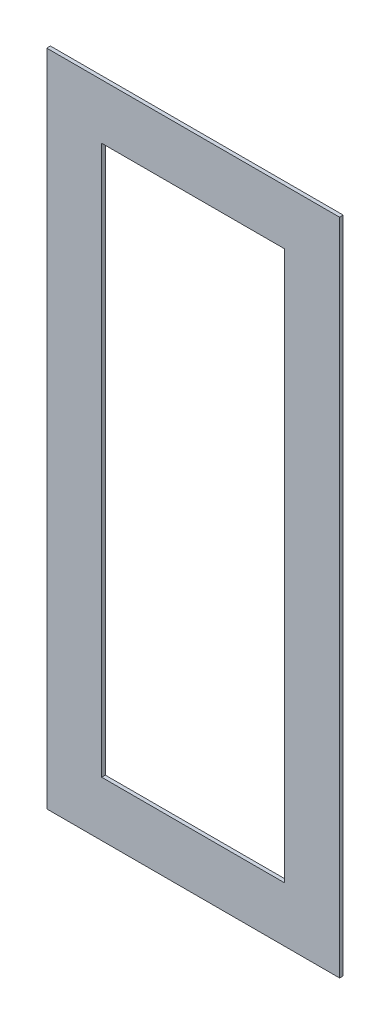
ISO-10303-21;
HEADER;
FILE_DESCRIPTION(('STEP AP214'),'2;1');
FILE_NAME('part.step','',(''),(''),'','','');
FILE_SCHEMA(('AUTOMOTIVE_DESIGN { 1 0 10303 214 1 1 1 1 }'));
ENDSEC;
DATA;
#1=APPLICATION_CONTEXT('core data for automotive mechanical design processes');
#2=APPLICATION_PROTOCOL_DEFINITION('international standard','automotive_design',2000,#1);
#3=PRODUCT_CONTEXT('',#1,'mechanical');
#4=PRODUCT('Part','Part','',(#3));
#5=PRODUCT_RELATED_PRODUCT_CATEGORY('part','',(#4));
#6=PRODUCT_DEFINITION_FORMATION('','',#4);
#7=PRODUCT_DEFINITION_CONTEXT('part definition',#1,'design');
#8=PRODUCT_DEFINITION('design','',#6,#7);
#9=PRODUCT_DEFINITION_SHAPE('','',#8);
#10=(LENGTH_UNIT() NAMED_UNIT(*) SI_UNIT(.MILLI.,.METRE.));
#11=(NAMED_UNIT(*) PLANE_ANGLE_UNIT() SI_UNIT($,.RADIAN.));
#12=(NAMED_UNIT(*) SI_UNIT($,.STERADIAN.) SOLID_ANGLE_UNIT());
#13=UNCERTAINTY_MEASURE_WITH_UNIT(LENGTH_MEASURE(1.E-05),#10,'distance_accuracy_value','');
#14=(GEOMETRIC_REPRESENTATION_CONTEXT(3) GLOBAL_UNCERTAINTY_ASSIGNED_CONTEXT((#13)) GLOBAL_UNIT_ASSIGNED_CONTEXT((#10,
#11,#12)) REPRESENTATION_CONTEXT('',''));
#15=CARTESIAN_POINT('',(0.,0.,0.));
#16=DIRECTION('',(0.,0.,1.));
#17=DIRECTION('',(1.,0.,0.));
#18=AXIS2_PLACEMENT_3D('',#15,#16,#17);
#19=CARTESIAN_POINT('',(0.,0.,0.2));
#20=DIRECTION('',(0.,0.,-1.));
#21=DIRECTION('',(-1.,0.,0.));
#22=AXIS2_PLACEMENT_3D('',#19,#20,#21);
#23=PLANE('',#22);
#24=DIRECTION('',(0.,1.,0.));
#25=VECTOR('',#24,1.);
#26=CARTESIAN_POINT('',(8.,18.,0.2));
#27=LINE('',#26,#25);
#28=CARTESIAN_POINT('',(8.,-18.,0.2));
#29=VERTEX_POINT('',#28);
#30=CARTESIAN_POINT('',(8.,18.,0.2));
#31=VERTEX_POINT('',#30);
#32=EDGE_CURVE('E134',#29,#31,#27,.T.);
#33=ORIENTED_EDGE('',*,*,#32,.T.);
#34=DIRECTION('',(-1.,0.,0.));
#35=VECTOR('',#34,1.);
#36=CARTESIAN_POINT('',(8.,18.,0.2));
#37=LINE('',#36,#35);
#38=CARTESIAN_POINT('',(-8.,18.,0.2));
#39=VERTEX_POINT('',#38);
#40=EDGE_CURVE('E137',#31,#39,#37,.T.);
#41=ORIENTED_EDGE('',*,*,#40,.T.);
#42=DIRECTION('',(0.,-1.,0.));
#43=VECTOR('',#42,1.);
#44=CARTESIAN_POINT('',(-8.,18.,0.2));
#45=LINE('',#44,#43);
#46=CARTESIAN_POINT('',(-8.,-18.,0.2));
#47=VERTEX_POINT('',#46);
#48=EDGE_CURVE('E140',#39,#47,#45,.T.);
#49=ORIENTED_EDGE('',*,*,#48,.T.);
#50=DIRECTION('',(1.,0.,0.));
#51=VECTOR('',#50,1.);
#52=CARTESIAN_POINT('',(8.,-18.,0.2));
#53=LINE('',#52,#51);
#54=EDGE_CURVE('E142',#47,#29,#53,.T.);
#55=ORIENTED_EDGE('',*,*,#54,.T.);
#56=EDGE_LOOP('',(#33,#41,#49,#55));
#57=FACE_BOUND('',#56,.T.);
#58=DIRECTION('',(0.,-1.,0.));
#59=VECTOR('',#58,1.);
#60=CARTESIAN_POINT('',(-5.,15.,0.2));
#61=LINE('',#60,#59);
#62=CARTESIAN_POINT('',(-5.,15.,0.2));
#63=VERTEX_POINT('',#62);
#64=CARTESIAN_POINT('',(-5.,-15.,0.2));
#65=VERTEX_POINT('',#64);
#66=EDGE_CURVE('E98',#63,#65,#61,.T.);
#67=ORIENTED_EDGE('',*,*,#66,.F.);
#68=DIRECTION('',(-1.,0.,0.));
#69=VECTOR('',#68,1.);
#70=CARTESIAN_POINT('',(5.,15.,0.2));
#71=LINE('',#70,#69);
#72=CARTESIAN_POINT('',(5.,15.,0.2));
#73=VERTEX_POINT('',#72);
#74=EDGE_CURVE('E120',#73,#63,#71,.T.);
#75=ORIENTED_EDGE('',*,*,#74,.F.);
#76=DIRECTION('',(0.,1.,0.));
#77=VECTOR('',#76,1.);
#78=CARTESIAN_POINT('',(5.,15.,0.2));
#79=LINE('',#78,#77);
#80=CARTESIAN_POINT('',(5.,-15.,0.2));
#81=VERTEX_POINT('',#80);
#82=EDGE_CURVE('E118',#81,#73,#79,.T.);
#83=ORIENTED_EDGE('',*,*,#82,.F.);
#84=DIRECTION('',(1.,0.,0.));
#85=VECTOR('',#84,1.);
#86=CARTESIAN_POINT('',(5.,-15.,0.2));
#87=LINE('',#86,#85);
#88=EDGE_CURVE('E106',#65,#81,#87,.T.);
#89=ORIENTED_EDGE('',*,*,#88,.F.);
#90=EDGE_LOOP('',(#67,#75,#83,#89));
#91=FACE_BOUND('',#90,.T.);
#92=ADVANCED_FACE('F33',(#57,#91),#23,.F.);
#93=CARTESIAN_POINT('',(0.,0.,0.));
#94=DIRECTION('',(0.,0.,-1.));
#95=DIRECTION('',(-1.,0.,0.));
#96=AXIS2_PLACEMENT_3D('',#93,#94,#95);
#97=PLANE('',#96);
#98=DIRECTION('',(0.,1.,0.));
#99=VECTOR('',#98,1.);
#100=CARTESIAN_POINT('',(8.,18.,0.));
#101=LINE('',#100,#99);
#102=CARTESIAN_POINT('',(8.,-18.,0.));
#103=VERTEX_POINT('',#102);
#104=CARTESIAN_POINT('',(8.,18.,0.));
#105=VERTEX_POINT('',#104);
#106=EDGE_CURVE('E114',#103,#105,#101,.T.);
#107=ORIENTED_EDGE('',*,*,#106,.F.);
#108=DIRECTION('',(1.,0.,0.));
#109=VECTOR('',#108,1.);
#110=CARTESIAN_POINT('',(8.,-18.,0.));
#111=LINE('',#110,#109);
#112=CARTESIAN_POINT('',(-8.,-18.,0.));
#113=VERTEX_POINT('',#112);
#114=EDGE_CURVE('E138',#113,#103,#111,.T.);
#115=ORIENTED_EDGE('',*,*,#114,.F.);
#116=DIRECTION('',(0.,-1.,0.));
#117=VECTOR('',#116,1.);
#118=CARTESIAN_POINT('',(-8.,18.,0.));
#119=LINE('',#118,#117);
#120=CARTESIAN_POINT('',(-8.,18.,0.));
#121=VERTEX_POINT('',#120);
#122=EDGE_CURVE('E149',#121,#113,#119,.T.);
#123=ORIENTED_EDGE('',*,*,#122,.F.);
#124=DIRECTION('',(-1.,0.,0.));
#125=VECTOR('',#124,1.);
#126=CARTESIAN_POINT('',(8.,18.,0.));
#127=LINE('',#126,#125);
#128=EDGE_CURVE('E147',#105,#121,#127,.T.);
#129=ORIENTED_EDGE('',*,*,#128,.F.);
#130=EDGE_LOOP('',(#107,#115,#123,#129));
#131=FACE_BOUND('',#130,.T.);
#132=DIRECTION('',(-1.,0.,0.));
#133=VECTOR('',#132,1.);
#134=CARTESIAN_POINT('',(5.,15.,0.));
#135=LINE('',#134,#133);
#136=CARTESIAN_POINT('',(5.,15.,0.));
#137=VERTEX_POINT('',#136);
#138=CARTESIAN_POINT('',(-5.,15.,0.));
#139=VERTEX_POINT('',#138);
#140=EDGE_CURVE('E107',#137,#139,#135,.T.);
#141=ORIENTED_EDGE('',*,*,#140,.T.);
#142=DIRECTION('',(0.,-1.,0.));
#143=VECTOR('',#142,1.);
#144=CARTESIAN_POINT('',(-5.,15.,0.));
#145=LINE('',#144,#143);
#146=CARTESIAN_POINT('',(-5.,-15.,0.));
#147=VERTEX_POINT('',#146);
#148=EDGE_CURVE('E56',#139,#147,#145,.T.);
#149=ORIENTED_EDGE('',*,*,#148,.T.);
#150=DIRECTION('',(1.,0.,0.));
#151=VECTOR('',#150,1.);
#152=CARTESIAN_POINT('',(5.,-15.,0.));
#153=LINE('',#152,#151);
#154=CARTESIAN_POINT('',(5.,-15.,0.));
#155=VERTEX_POINT('',#154);
#156=EDGE_CURVE('E113',#147,#155,#153,.T.);
#157=ORIENTED_EDGE('',*,*,#156,.T.);
#158=DIRECTION('',(0.,1.,0.));
#159=VECTOR('',#158,1.);
#160=CARTESIAN_POINT('',(5.,15.,0.));
#161=LINE('',#160,#159);
#162=EDGE_CURVE('E126',#155,#137,#161,.T.);
#163=ORIENTED_EDGE('',*,*,#162,.T.);
#164=EDGE_LOOP('',(#141,#149,#157,#163));
#165=FACE_BOUND('',#164,.T.);
#166=ADVANCED_FACE('F167',(#131,#165),#97,.T.);
#167=CARTESIAN_POINT('',(8.,18.,0.2));
#168=DIRECTION('',(-1.,0.,0.));
#169=DIRECTION('',(0.,-1.,0.));
#170=AXIS2_PLACEMENT_3D('',#167,#168,#169);
#171=PLANE('',#170);
#172=ORIENTED_EDGE('',*,*,#106,.T.);
#173=DIRECTION('',(0.,0.,-1.));
#174=VECTOR('',#173,1.);
#175=CARTESIAN_POINT('',(8.,18.,0.2));
#176=LINE('',#175,#174);
#177=EDGE_CURVE('E11',#31,#105,#176,.T.);
#178=ORIENTED_EDGE('',*,*,#177,.F.);
#179=ORIENTED_EDGE('',*,*,#32,.F.);
#180=DIRECTION('',(0.,0.,-1.));
#181=VECTOR('',#180,1.);
#182=CARTESIAN_POINT('',(8.,-18.,0.2));
#183=LINE('',#182,#181);
#184=EDGE_CURVE('E144',#29,#103,#183,.T.);
#185=ORIENTED_EDGE('',*,*,#184,.T.);
#186=EDGE_LOOP('',(#172,#178,#179,#185));
#187=FACE_BOUND('',#186,.T.);
#188=ADVANCED_FACE('F35',(#187),#171,.F.);
#189=CARTESIAN_POINT('',(8.,18.,0.2));
#190=DIRECTION('',(0.,-1.,0.));
#191=DIRECTION('',(1.,0.,0.));
#192=AXIS2_PLACEMENT_3D('',#189,#190,#191);
#193=PLANE('',#192);
#194=ORIENTED_EDGE('',*,*,#128,.T.);
#195=DIRECTION('',(0.,0.,-1.));
#196=VECTOR('',#195,1.);
#197=CARTESIAN_POINT('',(-8.,18.,0.2));
#198=LINE('',#197,#196);
#199=EDGE_CURVE('E41',#39,#121,#198,.T.);
#200=ORIENTED_EDGE('',*,*,#199,.F.);
#201=ORIENTED_EDGE('',*,*,#40,.F.);
#202=ORIENTED_EDGE('',*,*,#177,.T.);
#203=EDGE_LOOP('',(#194,#200,#201,#202));
#204=FACE_BOUND('',#203,.T.);
#205=ADVANCED_FACE('F177',(#204),#193,.F.);
#206=CARTESIAN_POINT('',(-8.,18.,0.2));
#207=DIRECTION('',(1.,0.,0.));
#208=DIRECTION('',(0.,1.,0.));
#209=AXIS2_PLACEMENT_3D('',#206,#207,#208);
#210=PLANE('',#209);
#211=ORIENTED_EDGE('',*,*,#122,.T.);
#212=DIRECTION('',(0.,0.,-1.));
#213=VECTOR('',#212,1.);
#214=CARTESIAN_POINT('',(-8.,-18.,0.2));
#215=LINE('',#214,#213);
#216=EDGE_CURVE('E154',#47,#113,#215,.T.);
#217=ORIENTED_EDGE('',*,*,#216,.F.);
#218=ORIENTED_EDGE('',*,*,#48,.F.);
#219=ORIENTED_EDGE('',*,*,#199,.T.);
#220=EDGE_LOOP('',(#211,#217,#218,#219));
#221=FACE_BOUND('',#220,.T.);
#222=ADVANCED_FACE('F161',(#221),#210,.F.);
#223=CARTESIAN_POINT('',(8.,-18.,0.2));
#224=DIRECTION('',(0.,1.,0.));
#225=DIRECTION('',(-1.,0.,0.));
#226=AXIS2_PLACEMENT_3D('',#223,#224,#225);
#227=PLANE('',#226);
#228=ORIENTED_EDGE('',*,*,#114,.T.);
#229=ORIENTED_EDGE('',*,*,#184,.F.);
#230=ORIENTED_EDGE('',*,*,#54,.F.);
#231=ORIENTED_EDGE('',*,*,#216,.T.);
#232=EDGE_LOOP('',(#228,#229,#230,#231));
#233=FACE_BOUND('',#232,.T.);
#234=ADVANCED_FACE('F171',(#233),#227,.F.);
#235=CARTESIAN_POINT('',(-5.,15.,0.2));
#236=DIRECTION('',(1.,0.,0.));
#237=DIRECTION('',(0.,1.,0.));
#238=AXIS2_PLACEMENT_3D('',#235,#236,#237);
#239=PLANE('',#238);
#240=ORIENTED_EDGE('',*,*,#148,.F.);
#241=DIRECTION('',(0.,0.,-1.));
#242=VECTOR('',#241,1.);
#243=CARTESIAN_POINT('',(-5.,15.,0.2));
#244=LINE('',#243,#242);
#245=EDGE_CURVE('E102',#63,#139,#244,.T.);
#246=ORIENTED_EDGE('',*,*,#245,.F.);
#247=ORIENTED_EDGE('',*,*,#66,.T.);
#248=DIRECTION('',(0.,0.,-1.));
#249=VECTOR('',#248,1.);
#250=CARTESIAN_POINT('',(-5.,-15.,0.2));
#251=LINE('',#250,#249);
#252=EDGE_CURVE('E101',#65,#147,#251,.T.);
#253=ORIENTED_EDGE('',*,*,#252,.T.);
#254=EDGE_LOOP('',(#240,#246,#247,#253));
#255=FACE_BOUND('',#254,.T.);
#256=ADVANCED_FACE('F100',(#255),#239,.T.);
#257=CARTESIAN_POINT('',(5.,-15.,0.2));
#258=DIRECTION('',(0.,1.,0.));
#259=DIRECTION('',(-1.,0.,0.));
#260=AXIS2_PLACEMENT_3D('',#257,#258,#259);
#261=PLANE('',#260);
#262=ORIENTED_EDGE('',*,*,#156,.F.);
#263=ORIENTED_EDGE('',*,*,#252,.F.);
#264=ORIENTED_EDGE('',*,*,#88,.T.);
#265=DIRECTION('',(0.,0.,-1.));
#266=VECTOR('',#265,1.);
#267=CARTESIAN_POINT('',(5.,-15.,0.2));
#268=LINE('',#267,#266);
#269=EDGE_CURVE('E115',#81,#155,#268,.T.);
#270=ORIENTED_EDGE('',*,*,#269,.T.);
#271=EDGE_LOOP('',(#262,#263,#264,#270));
#272=FACE_BOUND('',#271,.T.);
#273=ADVANCED_FACE('F110',(#272),#261,.T.);
#274=CARTESIAN_POINT('',(5.,15.,0.2));
#275=DIRECTION('',(-1.,0.,0.));
#276=DIRECTION('',(0.,-1.,0.));
#277=AXIS2_PLACEMENT_3D('',#274,#275,#276);
#278=PLANE('',#277);
#279=ORIENTED_EDGE('',*,*,#162,.F.);
#280=ORIENTED_EDGE('',*,*,#269,.F.);
#281=ORIENTED_EDGE('',*,*,#82,.T.);
#282=DIRECTION('',(0.,0.,-1.));
#283=VECTOR('',#282,1.);
#284=CARTESIAN_POINT('',(5.,15.,0.2));
#285=LINE('',#284,#283);
#286=EDGE_CURVE('E48',#73,#137,#285,.T.);
#287=ORIENTED_EDGE('',*,*,#286,.T.);
#288=EDGE_LOOP('',(#279,#280,#281,#287));
#289=FACE_BOUND('',#288,.T.);
#290=ADVANCED_FACE('F200',(#289),#278,.T.);
#291=CARTESIAN_POINT('',(5.,15.,0.2));
#292=DIRECTION('',(0.,-1.,0.));
#293=DIRECTION('',(1.,0.,0.));
#294=AXIS2_PLACEMENT_3D('',#291,#292,#293);
#295=PLANE('',#294);
#296=ORIENTED_EDGE('',*,*,#140,.F.);
#297=ORIENTED_EDGE('',*,*,#286,.F.);
#298=ORIENTED_EDGE('',*,*,#74,.T.);
#299=ORIENTED_EDGE('',*,*,#245,.T.);
#300=EDGE_LOOP('',(#296,#297,#298,#299));
#301=FACE_BOUND('',#300,.T.);
#302=ADVANCED_FACE('F204',(#301),#295,.T.);
#303=CLOSED_SHELL('',(#92,#166,#188,#205,#222,#234,#256,#273,#290,#302));
#304=MANIFOLD_SOLID_BREP('B2',#303);
#305=ADVANCED_BREP_SHAPE_REPRESENTATION('',(#18,#304),#14);
#306=SHAPE_DEFINITION_REPRESENTATION(#9,#305);
ENDSEC;
END-ISO-10303-21;
